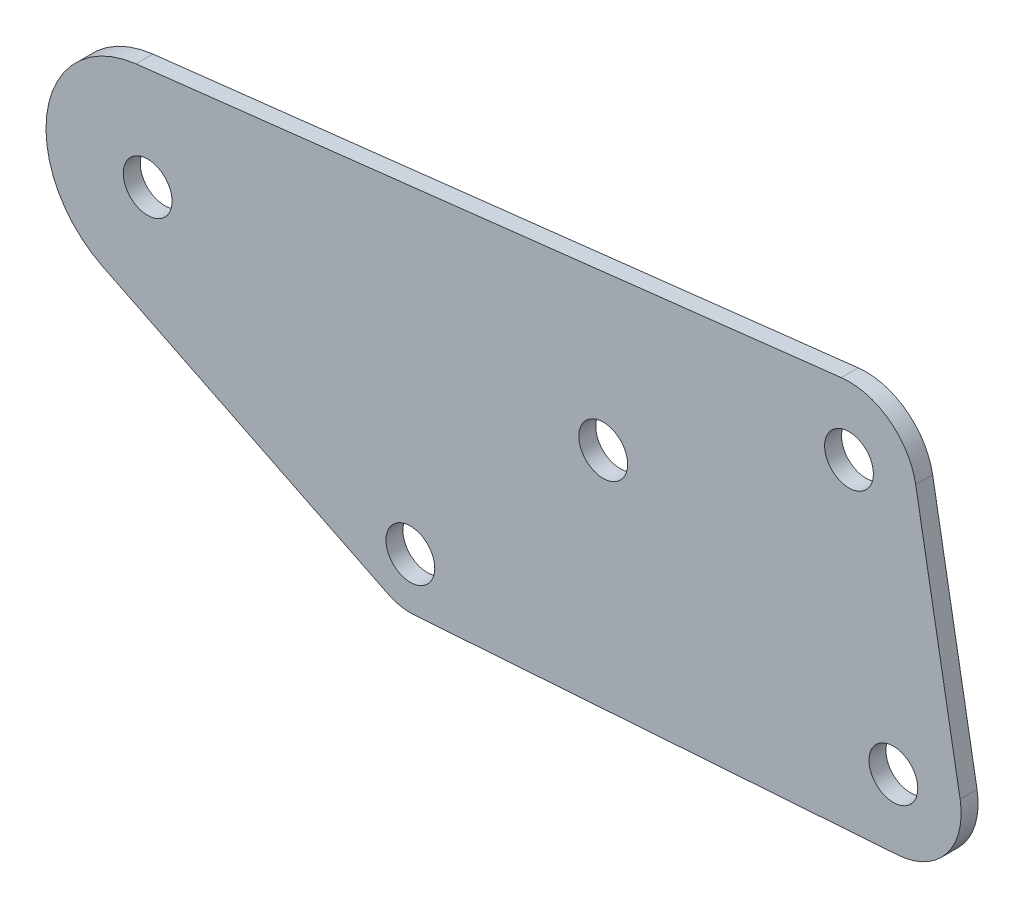
ISO-10303-21;
HEADER;
FILE_DESCRIPTION(('STEP AP214'),'2;1');
FILE_NAME('part.step','',(''),(''),'','','');
FILE_SCHEMA(('AUTOMOTIVE_DESIGN { 1 0 10303 214 1 1 1 1 }'));
ENDSEC;
DATA;
#1=APPLICATION_CONTEXT('core data for automotive mechanical design processes');
#2=APPLICATION_PROTOCOL_DEFINITION('international standard','automotive_design',2000,#1);
#3=PRODUCT_CONTEXT('',#1,'mechanical');
#4=PRODUCT('Part','Part','',(#3));
#5=PRODUCT_RELATED_PRODUCT_CATEGORY('part','',(#4));
#6=PRODUCT_DEFINITION_FORMATION('','',#4);
#7=PRODUCT_DEFINITION_CONTEXT('part definition',#1,'design');
#8=PRODUCT_DEFINITION('design','',#6,#7);
#9=PRODUCT_DEFINITION_SHAPE('','',#8);
#10=(LENGTH_UNIT() NAMED_UNIT(*) SI_UNIT(.MILLI.,.METRE.));
#11=(NAMED_UNIT(*) PLANE_ANGLE_UNIT() SI_UNIT($,.RADIAN.));
#12=(NAMED_UNIT(*) SI_UNIT($,.STERADIAN.) SOLID_ANGLE_UNIT());
#13=UNCERTAINTY_MEASURE_WITH_UNIT(LENGTH_MEASURE(1.E-05),#10,'distance_accuracy_value','');
#14=(GEOMETRIC_REPRESENTATION_CONTEXT(3) GLOBAL_UNCERTAINTY_ASSIGNED_CONTEXT((#13)) GLOBAL_UNIT_ASSIGNED_CONTEXT((#10,
#11,#12)) REPRESENTATION_CONTEXT('',''));
#15=CARTESIAN_POINT('',(0.,0.,0.));
#16=DIRECTION('',(0.,0.,1.));
#17=DIRECTION('',(1.,0.,0.));
#18=AXIS2_PLACEMENT_3D('',#15,#16,#17);
#19=CARTESIAN_POINT('',(0.,0.,1.5875));
#20=DIRECTION('',(0.,0.,1.));
#21=DIRECTION('',(1.,0.,0.));
#22=AXIS2_PLACEMENT_3D('',#19,#20,#21);
#23=PLANE('',#22);
#24=CARTESIAN_POINT('',(24.60625,-17.4625,1.5875));
#25=DIRECTION('',(0.,0.,1.));
#26=DIRECTION('',(1.,0.,0.));
#27=AXIS2_PLACEMENT_3D('',#24,#25,#26);
#28=CIRCLE('',#27,2.286);
#29=CARTESIAN_POINT('',(26.89225,-17.4625,1.5875));
#30=VERTEX_POINT('',#29);
#31=EDGE_CURVE('E252',#30,#30,#28,.T.);
#32=ORIENTED_EDGE('',*,*,#31,.F.);
#33=EDGE_LOOP('',(#32));
#34=FACE_BOUND('',#33,.T.);
#35=CARTESIAN_POINT('',(42.672,0.,1.5875));
#36=DIRECTION('',(0.,0.,1.));
#37=DIRECTION('',(1.,0.,0.));
#38=AXIS2_PLACEMENT_3D('',#35,#36,#37);
#39=CIRCLE('',#38,2.286);
#40=CARTESIAN_POINT('',(44.958,0.,1.5875));
#41=VERTEX_POINT('',#40);
#42=EDGE_CURVE('E237',#41,#41,#39,.T.);
#43=ORIENTED_EDGE('',*,*,#42,.F.);
#44=EDGE_LOOP('',(#43));
#45=FACE_BOUND('',#44,.T.);
#46=CARTESIAN_POINT('',(0.,0.,1.5875));
#47=DIRECTION('',(0.,0.,1.));
#48=DIRECTION('',(1.,0.,0.));
#49=AXIS2_PLACEMENT_3D('',#46,#47,#48);
#50=CIRCLE('',#49,9.525);
#51=CARTESIAN_POINT('',(-1.08593683317859,9.46289417643176,1.5875));
#52=VERTEX_POINT('',#51);
#53=CARTESIAN_POINT('',(-4.2174081296129,-8.5404387280909,1.5875));
#54=VERTEX_POINT('',#53);
#55=EDGE_CURVE('E187',#52,#54,#50,.T.);
#56=ORIENTED_EDGE('',*,*,#55,.T.);
#57=DIRECTION('',(0.896633987201145,-0.442772507045974,0.));
#58=VECTOR('',#57,1.);
#59=CARTESIAN_POINT('',(-4.2174081296129,-8.5404387280909,1.5875));
#60=LINE('',#59,#58);
#61=CARTESIAN_POINT('',(22.4975459351936,-21.7327193640455,1.5875));
#62=VERTEX_POINT('',#61);
#63=EDGE_CURVE('E117',#54,#62,#60,.T.);
#64=ORIENTED_EDGE('',*,*,#63,.T.);
#65=CARTESIAN_POINT('',(24.60625,-17.4625,1.5875));
#66=DIRECTION('',(0.,0.,1.));
#67=DIRECTION('',(1.,0.,0.));
#68=AXIS2_PLACEMENT_3D('',#65,#66,#67);
#69=CIRCLE('',#68,4.7625);
#70=CARTESIAN_POINT('',(24.9392336831331,-22.2133449897641,1.5875));
#71=VERTEX_POINT('',#70);
#72=EDGE_CURVE('E209',#62,#71,#69,.T.);
#73=ORIENTED_EDGE('',*,*,#72,.T.);
#74=DIRECTION('',(0.997552753756252,0.0699178337287283,0.));
#75=VECTOR('',#74,1.);
#76=CARTESIAN_POINT('',(24.9392336831331,-22.2133449897641,1.5875));
#77=LINE('',#76,#75);
#78=CARTESIAN_POINT('',(70.2939782441774,-19.0344599863522,1.5875));
#79=VERTEX_POINT('',#78);
#80=EDGE_CURVE('E223',#71,#79,#77,.T.);
#81=ORIENTED_EDGE('',*,*,#80,.T.);
#82=CARTESIAN_POINT('',(69.85,-12.7,1.5875));
#83=DIRECTION('',(0.,0.,1.));
#84=DIRECTION('',(-1.,0.,0.));
#85=AXIS2_PLACEMENT_3D('',#82,#83,#84);
#86=CIRCLE('',#85,6.35);
#87=CARTESIAN_POINT('',(76.1023555524151,-11.5906983971057,1.5875));
#88=VERTEX_POINT('',#87);
#89=EDGE_CURVE('E141',#79,#88,#86,.T.);
#90=ORIENTED_EDGE('',*,*,#89,.T.);
#91=DIRECTION('',(-0.174693165810126,0.984622921640176,0.));
#92=VECTOR('',#91,1.);
#93=CARTESIAN_POINT('',(76.1023555524151,-11.5906983971057,1.5875));
#94=LINE('',#93,#92);
#95=CARTESIAN_POINT('',(71.9445733431461,11.8438054511079,1.5875));
#96=VERTEX_POINT('',#95);
#97=EDGE_CURVE('E135',#88,#96,#94,.T.);
#98=ORIENTED_EDGE('',*,*,#97,.T.);
#99=CARTESIAN_POINT('',(65.692217790731,10.7345038482136,1.5875));
#100=DIRECTION('',(0.,0.,1.));
#101=DIRECTION('',(1.,0.,0.));
#102=AXIS2_PLACEMENT_3D('',#99,#100,#101);
#103=CIRCLE('',#102,6.35);
#104=CARTESIAN_POINT('',(64.9682599019453,17.0430999658348,1.5875));
#105=VERTEX_POINT('',#104);
#106=EDGE_CURVE('E139',#96,#105,#103,.T.);
#107=ORIENTED_EDGE('',*,*,#106,.T.);
#108=DIRECTION('',(-0.993479703562389,-0.114009116344209,0.));
#109=VECTOR('',#108,1.);
#110=CARTESIAN_POINT('',(64.9682599019453,17.0430999658348,1.5875));
#111=LINE('',#110,#109);
#112=EDGE_CURVE('E66',#105,#52,#111,.T.);
#113=ORIENTED_EDGE('',*,*,#112,.T.);
#114=EDGE_LOOP('',(#56,#64,#73,#81,#90,#98,#107,#113));
#115=FACE_BOUND('',#114,.T.);
#116=CARTESIAN_POINT('',(0.,0.,1.5875));
#117=DIRECTION('',(0.,0.,1.));
#118=DIRECTION('',(1.,0.,0.));
#119=AXIS2_PLACEMENT_3D('',#116,#117,#118);
#120=CIRCLE('',#119,2.286);
#121=CARTESIAN_POINT('',(2.286,0.,1.5875));
#122=VERTEX_POINT('',#121);
#123=EDGE_CURVE('E169',#122,#122,#120,.T.);
#124=ORIENTED_EDGE('',*,*,#123,.F.);
#125=EDGE_LOOP('',(#124));
#126=FACE_BOUND('',#125,.T.);
#127=CARTESIAN_POINT('',(65.692217790731,10.7345038482136,1.5875));
#128=DIRECTION('',(0.,0.,1.));
#129=DIRECTION('',(1.,0.,0.));
#130=AXIS2_PLACEMENT_3D('',#127,#128,#129);
#131=CIRCLE('',#130,2.28599999999998);
#132=CARTESIAN_POINT('',(67.978217790731,10.7345038482136,1.5875));
#133=VERTEX_POINT('',#132);
#134=EDGE_CURVE('E244',#133,#133,#131,.T.);
#135=ORIENTED_EDGE('',*,*,#134,.F.);
#136=EDGE_LOOP('',(#135));
#137=FACE_BOUND('',#136,.T.);
#138=CARTESIAN_POINT('',(69.85,-12.7,1.5875));
#139=DIRECTION('',(0.,0.,1.));
#140=DIRECTION('',(1.,0.,0.));
#141=AXIS2_PLACEMENT_3D('',#138,#139,#140);
#142=CIRCLE('',#141,2.28599999999999);
#143=CARTESIAN_POINT('',(72.136,-12.7,1.5875));
#144=VERTEX_POINT('',#143);
#145=EDGE_CURVE('E260',#144,#144,#142,.T.);
#146=ORIENTED_EDGE('',*,*,#145,.F.);
#147=EDGE_LOOP('',(#146));
#148=FACE_BOUND('',#147,.T.);
#149=ADVANCED_FACE('F45',(#34,#45,#115,#126,#137,#148),#23,.T.);
#150=CARTESIAN_POINT('',(0.,0.,0.));
#151=DIRECTION('',(0.,0.,1.));
#152=DIRECTION('',(1.,0.,0.));
#153=AXIS2_PLACEMENT_3D('',#150,#151,#152);
#154=PLANE('',#153);
#155=CARTESIAN_POINT('',(0.,0.,0.));
#156=DIRECTION('',(0.,0.,1.));
#157=DIRECTION('',(1.,0.,0.));
#158=AXIS2_PLACEMENT_3D('',#155,#156,#157);
#159=CIRCLE('',#158,9.525);
#160=CARTESIAN_POINT('',(-1.08593683317859,9.46289417643176,0.));
#161=VERTEX_POINT('',#160);
#162=CARTESIAN_POINT('',(-4.2174081296129,-8.5404387280909,0.));
#163=VERTEX_POINT('',#162);
#164=EDGE_CURVE('E164',#161,#163,#159,.T.);
#165=ORIENTED_EDGE('',*,*,#164,.F.);
#166=DIRECTION('',(-0.993479703562389,-0.114009116344209,0.));
#167=VECTOR('',#166,1.);
#168=CARTESIAN_POINT('',(64.9682599019453,17.0430999658348,0.));
#169=LINE('',#168,#167);
#170=CARTESIAN_POINT('',(64.9682599019453,17.0430999658348,0.));
#171=VERTEX_POINT('',#170);
#172=EDGE_CURVE('E109',#171,#161,#169,.T.);
#173=ORIENTED_EDGE('',*,*,#172,.F.);
#174=CARTESIAN_POINT('',(65.692217790731,10.7345038482136,0.));
#175=DIRECTION('',(0.,0.,1.));
#176=DIRECTION('',(1.,0.,0.));
#177=AXIS2_PLACEMENT_3D('',#174,#175,#176);
#178=CIRCLE('',#177,6.35);
#179=CARTESIAN_POINT('',(71.9445733431461,11.8438054511079,0.));
#180=VERTEX_POINT('',#179);
#181=EDGE_CURVE('E102',#180,#171,#178,.T.);
#182=ORIENTED_EDGE('',*,*,#181,.F.);
#183=DIRECTION('',(-0.174693165810126,0.984622921640176,0.));
#184=VECTOR('',#183,1.);
#185=CARTESIAN_POINT('',(76.1023555524151,-11.5906983971057,0.));
#186=LINE('',#185,#184);
#187=CARTESIAN_POINT('',(76.1023555524151,-11.5906983971057,0.));
#188=VERTEX_POINT('',#187);
#189=EDGE_CURVE('E150',#188,#180,#186,.T.);
#190=ORIENTED_EDGE('',*,*,#189,.F.);
#191=CARTESIAN_POINT('',(69.85,-12.7,0.));
#192=DIRECTION('',(0.,0.,1.));
#193=DIRECTION('',(-1.,0.,0.));
#194=AXIS2_PLACEMENT_3D('',#191,#192,#193);
#195=CIRCLE('',#194,6.35);
#196=CARTESIAN_POINT('',(70.2939782441774,-19.0344599863522,0.));
#197=VERTEX_POINT('',#196);
#198=EDGE_CURVE('E178',#197,#188,#195,.T.);
#199=ORIENTED_EDGE('',*,*,#198,.F.);
#200=DIRECTION('',(0.997552753756252,0.0699178337287283,0.));
#201=VECTOR('',#200,1.);
#202=CARTESIAN_POINT('',(24.9392336831331,-22.2133449897641,0.));
#203=LINE('',#202,#201);
#204=CARTESIAN_POINT('',(24.9392336831331,-22.2133449897641,0.));
#205=VERTEX_POINT('',#204);
#206=EDGE_CURVE('E175',#205,#197,#203,.T.);
#207=ORIENTED_EDGE('',*,*,#206,.F.);
#208=CARTESIAN_POINT('',(24.60625,-17.4625,0.));
#209=DIRECTION('',(0.,0.,1.));
#210=DIRECTION('',(1.,0.,0.));
#211=AXIS2_PLACEMENT_3D('',#208,#209,#210);
#212=CIRCLE('',#211,4.7625);
#213=CARTESIAN_POINT('',(22.4975459351936,-21.7327193640455,0.));
#214=VERTEX_POINT('',#213);
#215=EDGE_CURVE('E172',#214,#205,#212,.T.);
#216=ORIENTED_EDGE('',*,*,#215,.F.);
#217=DIRECTION('',(0.896633987201145,-0.442772507045974,0.));
#218=VECTOR('',#217,1.);
#219=CARTESIAN_POINT('',(-4.2174081296129,-8.5404387280909,0.));
#220=LINE('',#219,#218);
#221=EDGE_CURVE('E168',#163,#214,#220,.T.);
#222=ORIENTED_EDGE('',*,*,#221,.F.);
#223=EDGE_LOOP('',(#165,#173,#182,#190,#199,#207,#216,#222));
#224=FACE_BOUND('',#223,.T.);
#225=CARTESIAN_POINT('',(0.,0.,0.));
#226=DIRECTION('',(0.,0.,1.));
#227=DIRECTION('',(1.,0.,0.));
#228=AXIS2_PLACEMENT_3D('',#225,#226,#227);
#229=CIRCLE('',#228,2.286);
#230=CARTESIAN_POINT('',(2.286,0.,0.));
#231=VERTEX_POINT('',#230);
#232=EDGE_CURVE('E233',#231,#231,#229,.T.);
#233=ORIENTED_EDGE('',*,*,#232,.T.);
#234=EDGE_LOOP('',(#233));
#235=FACE_BOUND('',#234,.T.);
#236=CARTESIAN_POINT('',(42.672,0.,0.));
#237=DIRECTION('',(0.,0.,1.));
#238=DIRECTION('',(1.,0.,0.));
#239=AXIS2_PLACEMENT_3D('',#236,#237,#238);
#240=CIRCLE('',#239,2.286);
#241=CARTESIAN_POINT('',(44.958,0.,0.));
#242=VERTEX_POINT('',#241);
#243=EDGE_CURVE('E241',#242,#242,#240,.T.);
#244=ORIENTED_EDGE('',*,*,#243,.T.);
#245=EDGE_LOOP('',(#244));
#246=FACE_BOUND('',#245,.T.);
#247=CARTESIAN_POINT('',(65.692217790731,10.7345038482136,0.));
#248=DIRECTION('',(0.,0.,1.));
#249=DIRECTION('',(1.,0.,0.));
#250=AXIS2_PLACEMENT_3D('',#247,#248,#249);
#251=CIRCLE('',#250,2.28599999999998);
#252=CARTESIAN_POINT('',(67.978217790731,10.7345038482136,0.));
#253=VERTEX_POINT('',#252);
#254=EDGE_CURVE('E248',#253,#253,#251,.T.);
#255=ORIENTED_EDGE('',*,*,#254,.T.);
#256=EDGE_LOOP('',(#255));
#257=FACE_BOUND('',#256,.T.);
#258=CARTESIAN_POINT('',(24.60625,-17.4625,0.));
#259=DIRECTION('',(0.,0.,1.));
#260=DIRECTION('',(1.,0.,0.));
#261=AXIS2_PLACEMENT_3D('',#258,#259,#260);
#262=CIRCLE('',#261,2.286);
#263=CARTESIAN_POINT('',(26.89225,-17.4625,0.));
#264=VERTEX_POINT('',#263);
#265=EDGE_CURVE('E256',#264,#264,#262,.T.);
#266=ORIENTED_EDGE('',*,*,#265,.T.);
#267=EDGE_LOOP('',(#266));
#268=FACE_BOUND('',#267,.T.);
#269=CARTESIAN_POINT('',(69.85,-12.7,0.));
#270=DIRECTION('',(0.,0.,1.));
#271=DIRECTION('',(1.,0.,0.));
#272=AXIS2_PLACEMENT_3D('',#269,#270,#271);
#273=CIRCLE('',#272,2.28599999999999);
#274=CARTESIAN_POINT('',(72.136,-12.7,0.));
#275=VERTEX_POINT('',#274);
#276=EDGE_CURVE('E264',#275,#275,#273,.T.);
#277=ORIENTED_EDGE('',*,*,#276,.T.);
#278=EDGE_LOOP('',(#277));
#279=FACE_BOUND('',#278,.T.);
#280=ADVANCED_FACE('F213',(#224,#235,#246,#257,#268,#279),#154,.F.);
#281=CARTESIAN_POINT('',(0.,0.,1.5875));
#282=DIRECTION('',(0.,0.,-1.));
#283=DIRECTION('',(-1.,0.,0.));
#284=AXIS2_PLACEMENT_3D('',#281,#282,#283);
#285=CYLINDRICAL_SURFACE('',#284,9.525);
#286=ORIENTED_EDGE('',*,*,#164,.T.);
#287=DIRECTION('',(0.,0.,-1.));
#288=VECTOR('',#287,1.);
#289=CARTESIAN_POINT('',(-4.2174081296129,-8.5404387280909,1.5875));
#290=LINE('',#289,#288);
#291=EDGE_CURVE('E11',#54,#163,#290,.T.);
#292=ORIENTED_EDGE('',*,*,#291,.F.);
#293=ORIENTED_EDGE('',*,*,#55,.F.);
#294=DIRECTION('',(0.,0.,-1.));
#295=VECTOR('',#294,1.);
#296=CARTESIAN_POINT('',(-1.08593683317859,9.46289417643176,1.5875));
#297=LINE('',#296,#295);
#298=EDGE_CURVE('E160',#52,#161,#297,.T.);
#299=ORIENTED_EDGE('',*,*,#298,.T.);
#300=EDGE_LOOP('',(#286,#292,#293,#299));
#301=FACE_BOUND('',#300,.T.);
#302=ADVANCED_FACE('F47',(#301),#285,.T.);
#303=CARTESIAN_POINT('',(-4.2174081296129,-8.5404387280909,1.5875));
#304=DIRECTION('',(0.442772507045974,0.896633987201145,0.));
#305=DIRECTION('',(-0.896633987201145,0.442772507045974,0.));
#306=AXIS2_PLACEMENT_3D('',#303,#304,#305);
#307=PLANE('',#306);
#308=ORIENTED_EDGE('',*,*,#221,.T.);
#309=DIRECTION('',(0.,0.,-1.));
#310=VECTOR('',#309,1.);
#311=CARTESIAN_POINT('',(22.4975459351936,-21.7327193640455,1.5875));
#312=LINE('',#311,#310);
#313=EDGE_CURVE('E55',#62,#214,#312,.T.);
#314=ORIENTED_EDGE('',*,*,#313,.F.);
#315=ORIENTED_EDGE('',*,*,#63,.F.);
#316=ORIENTED_EDGE('',*,*,#291,.T.);
#317=EDGE_LOOP('',(#308,#314,#315,#316));
#318=FACE_BOUND('',#317,.T.);
#319=ADVANCED_FACE('F298',(#318),#307,.F.);
#320=CARTESIAN_POINT('',(24.60625,-17.4625,1.5875));
#321=DIRECTION('',(0.,0.,-1.));
#322=DIRECTION('',(-1.,0.,0.));
#323=AXIS2_PLACEMENT_3D('',#320,#321,#322);
#324=CYLINDRICAL_SURFACE('',#323,4.7625);
#325=ORIENTED_EDGE('',*,*,#215,.T.);
#326=DIRECTION('',(0.,0.,-1.));
#327=VECTOR('',#326,1.);
#328=CARTESIAN_POINT('',(24.9392336831331,-22.2133449897641,1.5875));
#329=LINE('',#328,#327);
#330=EDGE_CURVE('E198',#71,#205,#329,.T.);
#331=ORIENTED_EDGE('',*,*,#330,.F.);
#332=ORIENTED_EDGE('',*,*,#72,.F.);
#333=ORIENTED_EDGE('',*,*,#313,.T.);
#334=EDGE_LOOP('',(#325,#331,#332,#333));
#335=FACE_BOUND('',#334,.T.);
#336=ADVANCED_FACE('F207',(#335),#324,.T.);
#337=CARTESIAN_POINT('',(24.9392336831331,-22.2133449897641,1.5875));
#338=DIRECTION('',(-0.0699178337287283,0.997552753756252,0.));
#339=DIRECTION('',(-0.997552753756252,-0.0699178337287283,0.));
#340=AXIS2_PLACEMENT_3D('',#337,#338,#339);
#341=PLANE('',#340);
#342=ORIENTED_EDGE('',*,*,#206,.T.);
#343=DIRECTION('',(0.,0.,-1.));
#344=VECTOR('',#343,1.);
#345=CARTESIAN_POINT('',(70.2939782441774,-19.0344599863522,1.5875));
#346=LINE('',#345,#344);
#347=EDGE_CURVE('E194',#79,#197,#346,.T.);
#348=ORIENTED_EDGE('',*,*,#347,.F.);
#349=ORIENTED_EDGE('',*,*,#80,.F.);
#350=ORIENTED_EDGE('',*,*,#330,.T.);
#351=EDGE_LOOP('',(#342,#348,#349,#350));
#352=FACE_BOUND('',#351,.T.);
#353=ADVANCED_FACE('F218',(#352),#341,.F.);
#354=CARTESIAN_POINT('',(69.85,-12.7,1.5875));
#355=DIRECTION('',(0.,0.,-1.));
#356=DIRECTION('',(-1.,0.,0.));
#357=AXIS2_PLACEMENT_3D('',#354,#355,#356);
#358=CYLINDRICAL_SURFACE('',#357,6.35);
#359=ORIENTED_EDGE('',*,*,#198,.T.);
#360=DIRECTION('',(0.,0.,-1.));
#361=VECTOR('',#360,1.);
#362=CARTESIAN_POINT('',(76.1023555524151,-11.5906983971057,1.5875));
#363=LINE('',#362,#361);
#364=EDGE_CURVE('E152',#88,#188,#363,.T.);
#365=ORIENTED_EDGE('',*,*,#364,.F.);
#366=ORIENTED_EDGE('',*,*,#89,.F.);
#367=ORIENTED_EDGE('',*,*,#347,.T.);
#368=EDGE_LOOP('',(#359,#365,#366,#367));
#369=FACE_BOUND('',#368,.T.);
#370=ADVANCED_FACE('F221',(#369),#358,.T.);
#371=CARTESIAN_POINT('',(76.1023555524151,-11.5906983971057,1.5875));
#372=DIRECTION('',(-0.984622921640176,-0.174693165810125,0.));
#373=DIRECTION('',(0.174693165810126,-0.984622921640176,0.));
#374=AXIS2_PLACEMENT_3D('',#371,#372,#373);
#375=PLANE('',#374);
#376=ORIENTED_EDGE('',*,*,#189,.T.);
#377=DIRECTION('',(0.,0.,-1.));
#378=VECTOR('',#377,1.);
#379=CARTESIAN_POINT('',(71.9445733431461,11.8438054511079,1.5875));
#380=LINE('',#379,#378);
#381=EDGE_CURVE('E147',#96,#180,#380,.T.);
#382=ORIENTED_EDGE('',*,*,#381,.F.);
#383=ORIENTED_EDGE('',*,*,#97,.F.);
#384=ORIENTED_EDGE('',*,*,#364,.T.);
#385=EDGE_LOOP('',(#376,#382,#383,#384));
#386=FACE_BOUND('',#385,.T.);
#387=ADVANCED_FACE('F148',(#386),#375,.F.);
#388=CARTESIAN_POINT('',(65.692217790731,10.7345038482136,1.5875));
#389=DIRECTION('',(0.,0.,-1.));
#390=DIRECTION('',(-1.,0.,0.));
#391=AXIS2_PLACEMENT_3D('',#388,#389,#390);
#392=CYLINDRICAL_SURFACE('',#391,6.35);
#393=ORIENTED_EDGE('',*,*,#181,.T.);
#394=DIRECTION('',(0.,0.,-1.));
#395=VECTOR('',#394,1.);
#396=CARTESIAN_POINT('',(64.9682599019453,17.0430999658348,1.5875));
#397=LINE('',#396,#395);
#398=EDGE_CURVE('E153',#105,#171,#397,.T.);
#399=ORIENTED_EDGE('',*,*,#398,.F.);
#400=ORIENTED_EDGE('',*,*,#106,.F.);
#401=ORIENTED_EDGE('',*,*,#381,.T.);
#402=EDGE_LOOP('',(#393,#399,#400,#401));
#403=FACE_BOUND('',#402,.T.);
#404=ADVANCED_FACE('F155',(#403),#392,.T.);
#405=CARTESIAN_POINT('',(64.9682599019453,17.0430999658348,1.5875));
#406=DIRECTION('',(0.114009116344209,-0.993479703562389,0.));
#407=DIRECTION('',(0.993479703562389,0.114009116344209,0.));
#408=AXIS2_PLACEMENT_3D('',#405,#406,#407);
#409=PLANE('',#408);
#410=ORIENTED_EDGE('',*,*,#172,.T.);
#411=ORIENTED_EDGE('',*,*,#298,.F.);
#412=ORIENTED_EDGE('',*,*,#112,.F.);
#413=ORIENTED_EDGE('',*,*,#398,.T.);
#414=EDGE_LOOP('',(#410,#411,#412,#413));
#415=FACE_BOUND('',#414,.T.);
#416=ADVANCED_FACE('F286',(#415),#409,.F.);
#417=CARTESIAN_POINT('',(0.,0.,1.5875));
#418=DIRECTION('',(0.,0.,-1.));
#419=DIRECTION('',(-1.,0.,0.));
#420=AXIS2_PLACEMENT_3D('',#417,#418,#419);
#421=CYLINDRICAL_SURFACE('',#420,2.286);
#422=ORIENTED_EDGE('',*,*,#123,.T.);
#423=EDGE_LOOP('',(#422));
#424=FACE_BOUND('',#423,.T.);
#425=ORIENTED_EDGE('',*,*,#232,.F.);
#426=EDGE_LOOP('',(#425));
#427=FACE_BOUND('',#426,.T.);
#428=ADVANCED_FACE('F283',(#424,#427),#421,.F.);
#429=CARTESIAN_POINT('',(42.672,0.,1.5875));
#430=DIRECTION('',(0.,0.,-1.));
#431=DIRECTION('',(-1.,0.,0.));
#432=AXIS2_PLACEMENT_3D('',#429,#430,#431);
#433=CYLINDRICAL_SURFACE('',#432,2.286);
#434=ORIENTED_EDGE('',*,*,#42,.T.);
#435=EDGE_LOOP('',(#434));
#436=FACE_BOUND('',#435,.T.);
#437=ORIENTED_EDGE('',*,*,#243,.F.);
#438=EDGE_LOOP('',(#437));
#439=FACE_BOUND('',#438,.T.);
#440=ADVANCED_FACE('F364',(#436,#439),#433,.F.);
#441=CARTESIAN_POINT('',(65.692217790731,10.7345038482136,1.5875));
#442=DIRECTION('',(0.,0.,-1.));
#443=DIRECTION('',(-1.,0.,0.));
#444=AXIS2_PLACEMENT_3D('',#441,#442,#443);
#445=CYLINDRICAL_SURFACE('',#444,2.28599999999998);
#446=ORIENTED_EDGE('',*,*,#134,.T.);
#447=EDGE_LOOP('',(#446));
#448=FACE_BOUND('',#447,.T.);
#449=ORIENTED_EDGE('',*,*,#254,.F.);
#450=EDGE_LOOP('',(#449));
#451=FACE_BOUND('',#450,.T.);
#452=ADVANCED_FACE('F372',(#448,#451),#445,.F.);
#453=CARTESIAN_POINT('',(24.60625,-17.4625,1.5875));
#454=DIRECTION('',(0.,0.,-1.));
#455=DIRECTION('',(-1.,0.,0.));
#456=AXIS2_PLACEMENT_3D('',#453,#454,#455);
#457=CYLINDRICAL_SURFACE('',#456,2.286);
#458=ORIENTED_EDGE('',*,*,#31,.T.);
#459=EDGE_LOOP('',(#458));
#460=FACE_BOUND('',#459,.T.);
#461=ORIENTED_EDGE('',*,*,#265,.F.);
#462=EDGE_LOOP('',(#461));
#463=FACE_BOUND('',#462,.T.);
#464=ADVANCED_FACE('F380',(#460,#463),#457,.F.);
#465=CARTESIAN_POINT('',(69.85,-12.7,1.5875));
#466=DIRECTION('',(0.,0.,-1.));
#467=DIRECTION('',(-1.,0.,0.));
#468=AXIS2_PLACEMENT_3D('',#465,#466,#467);
#469=CYLINDRICAL_SURFACE('',#468,2.28599999999999);
#470=ORIENTED_EDGE('',*,*,#145,.T.);
#471=EDGE_LOOP('',(#470));
#472=FACE_BOUND('',#471,.T.);
#473=ORIENTED_EDGE('',*,*,#276,.F.);
#474=EDGE_LOOP('',(#473));
#475=FACE_BOUND('',#474,.T.);
#476=ADVANCED_FACE('F271',(#472,#475),#469,.F.);
#477=CLOSED_SHELL('',(#149,#280,#302,#319,#336,#353,#370,#387,#404,#416,#428,#440,#452,#464,#476));
#478=MANIFOLD_SOLID_BREP('B2',#477);
#479=ADVANCED_BREP_SHAPE_REPRESENTATION('',(#18,#478),#14);
#480=SHAPE_DEFINITION_REPRESENTATION(#9,#479);
ENDSEC;
END-ISO-10303-21;
